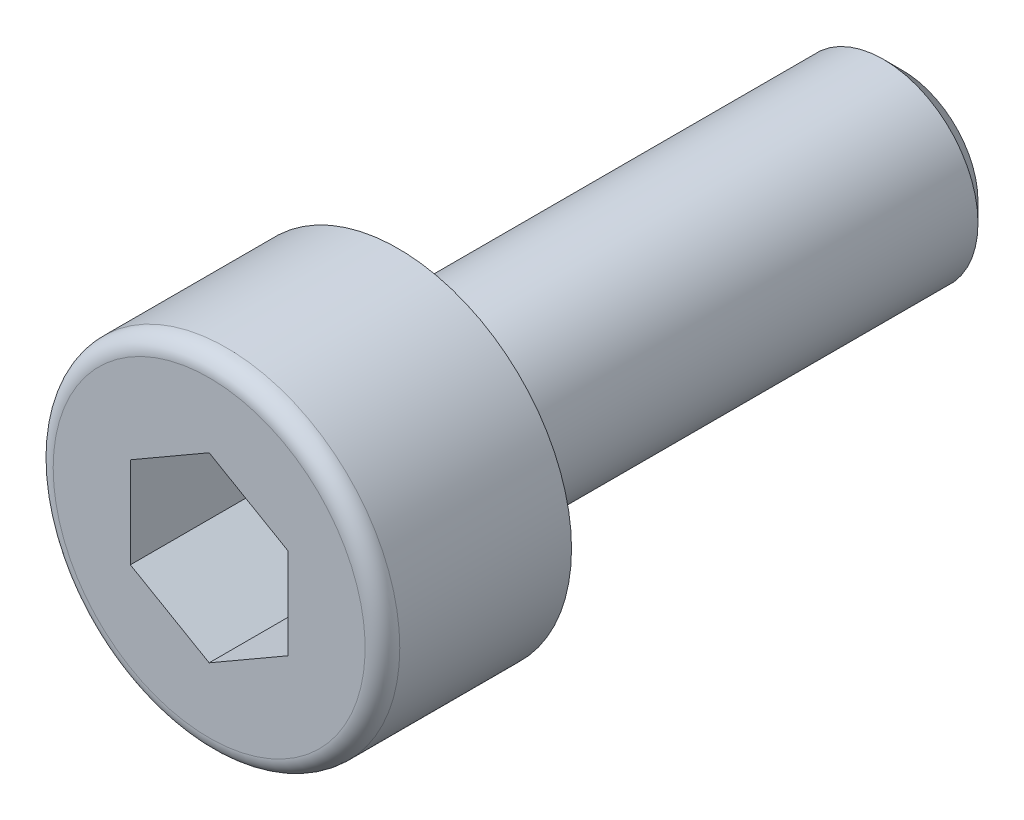
ISO-10303-21;
HEADER;
FILE_DESCRIPTION(('STEP AP214'),'2;1');
FILE_NAME('part.step','',(''),(''),'','','');
FILE_SCHEMA(('AUTOMOTIVE_DESIGN { 1 0 10303 214 1 1 1 1 }'));
ENDSEC;
DATA;
#1=APPLICATION_CONTEXT('core data for automotive mechanical design processes');
#2=APPLICATION_PROTOCOL_DEFINITION('international standard','automotive_design',2000,#1);
#3=PRODUCT_CONTEXT('',#1,'mechanical');
#4=PRODUCT('Part','Part','',(#3));
#5=PRODUCT_RELATED_PRODUCT_CATEGORY('part','',(#4));
#6=PRODUCT_DEFINITION_FORMATION('','',#4);
#7=PRODUCT_DEFINITION_CONTEXT('part definition',#1,'design');
#8=PRODUCT_DEFINITION('design','',#6,#7);
#9=PRODUCT_DEFINITION_SHAPE('','',#8);
#10=(LENGTH_UNIT() NAMED_UNIT(*) SI_UNIT(.MILLI.,.METRE.));
#11=(NAMED_UNIT(*) PLANE_ANGLE_UNIT() SI_UNIT($,.RADIAN.));
#12=(NAMED_UNIT(*) SI_UNIT($,.STERADIAN.) SOLID_ANGLE_UNIT());
#13=UNCERTAINTY_MEASURE_WITH_UNIT(LENGTH_MEASURE(1.E-05),#10,'distance_accuracy_value','');
#14=(GEOMETRIC_REPRESENTATION_CONTEXT(3) GLOBAL_UNCERTAINTY_ASSIGNED_CONTEXT((#13)) GLOBAL_UNIT_ASSIGNED_CONTEXT((#10,
#11,#12)) REPRESENTATION_CONTEXT('',''));
#15=CARTESIAN_POINT('',(0.,0.,0.));
#16=DIRECTION('',(0.,0.,1.));
#17=DIRECTION('',(1.,0.,0.));
#18=AXIS2_PLACEMENT_3D('',#15,#16,#17);
#19=CARTESIAN_POINT('',(0.,0.,3.));
#20=DIRECTION('',(0.,0.,-1.));
#21=DIRECTION('',(-1.,0.,0.));
#22=AXIS2_PLACEMENT_3D('',#19,#20,#21);
#23=PLANE('',#22);
#24=CARTESIAN_POINT('',(0.,0.,3.));
#25=DIRECTION('',(0.,0.,-1.));
#26=DIRECTION('',(-1.,0.,0.));
#27=AXIS2_PLACEMENT_3D('',#24,#25,#26);
#28=CIRCLE('',#27,2.475);
#29=CARTESIAN_POINT('',(-2.475,0.,3.));
#30=VERTEX_POINT('',#29);
#31=EDGE_CURVE('E177',#30,#30,#28,.F.);
#32=ORIENTED_EDGE('',*,*,#31,.T.);
#33=EDGE_LOOP('',(#32));
#34=FACE_BOUND('',#33,.T.);
#35=DIRECTION('',(-0.866025403784439,-0.5,0.));
#36=VECTOR('',#35,1.);
#37=CARTESIAN_POINT('',(0.,1.44337567297406,3.));
#38=LINE('',#37,#36);
#39=CARTESIAN_POINT('',(0.,1.44337567297406,3.));
#40=VERTEX_POINT('',#39);
#41=CARTESIAN_POINT('',(-1.25,0.721687836487032,3.));
#42=VERTEX_POINT('',#41);
#43=EDGE_CURVE('E141',#40,#42,#38,.T.);
#44=ORIENTED_EDGE('',*,*,#43,.F.);
#45=DIRECTION('',(-0.866025403784439,0.5,0.));
#46=VECTOR('',#45,1.);
#47=CARTESIAN_POINT('',(1.25,0.721687836487032,3.));
#48=LINE('',#47,#46);
#49=CARTESIAN_POINT('',(1.25,0.721687836487032,3.));
#50=VERTEX_POINT('',#49);
#51=EDGE_CURVE('E61',#50,#40,#48,.T.);
#52=ORIENTED_EDGE('',*,*,#51,.F.);
#53=DIRECTION('',(0.,1.,0.));
#54=VECTOR('',#53,1.);
#55=CARTESIAN_POINT('',(1.25,-0.721687836487032,3.));
#56=LINE('',#55,#54);
#57=CARTESIAN_POINT('',(1.25,-0.721687836487032,3.));
#58=VERTEX_POINT('',#57);
#59=EDGE_CURVE('E154',#58,#50,#56,.T.);
#60=ORIENTED_EDGE('',*,*,#59,.F.);
#61=DIRECTION('',(0.866025403784439,0.5,0.));
#62=VECTOR('',#61,1.);
#63=CARTESIAN_POINT('',(0.,-1.44337567297406,3.));
#64=LINE('',#63,#62);
#65=CARTESIAN_POINT('',(0.,-1.44337567297406,3.));
#66=VERTEX_POINT('',#65);
#67=EDGE_CURVE('E151',#66,#58,#64,.T.);
#68=ORIENTED_EDGE('',*,*,#67,.F.);
#69=DIRECTION('',(0.866025403784439,-0.5,0.));
#70=VECTOR('',#69,1.);
#71=CARTESIAN_POINT('',(-1.25,-0.721687836487033,3.));
#72=LINE('',#71,#70);
#73=CARTESIAN_POINT('',(-1.25,-0.721687836487033,3.));
#74=VERTEX_POINT('',#73);
#75=EDGE_CURVE('E109',#74,#66,#72,.T.);
#76=ORIENTED_EDGE('',*,*,#75,.F.);
#77=DIRECTION('',(0.,-1.,0.));
#78=VECTOR('',#77,1.);
#79=CARTESIAN_POINT('',(-1.25,0.721687836487032,3.));
#80=LINE('',#79,#78);
#81=EDGE_CURVE('E145',#42,#74,#80,.T.);
#82=ORIENTED_EDGE('',*,*,#81,.F.);
#83=EDGE_LOOP('',(#44,#52,#60,#68,#76,#82));
#84=FACE_BOUND('',#83,.T.);
#85=ADVANCED_FACE('F45',(#34,#84),#23,.F.);
#86=CARTESIAN_POINT('',(0.,0.,3.));
#87=DIRECTION('',(0.,0.,1.));
#88=DIRECTION('',(1.,0.,0.));
#89=AXIS2_PLACEMENT_3D('',#86,#87,#88);
#90=CYLINDRICAL_SURFACE('',#89,2.75);
#91=CARTESIAN_POINT('',(0.,0.,2.725));
#92=DIRECTION('',(0.,0.,-1.));
#93=DIRECTION('',(-1.,0.,0.));
#94=AXIS2_PLACEMENT_3D('',#91,#92,#93);
#95=CIRCLE('',#94,2.75);
#96=CARTESIAN_POINT('',(-2.75,0.,2.725));
#97=VERTEX_POINT('',#96);
#98=EDGE_CURVE('E181',#97,#97,#95,.T.);
#99=ORIENTED_EDGE('',*,*,#98,.T.);
#100=EDGE_LOOP('',(#99));
#101=FACE_BOUND('',#100,.T.);
#102=CARTESIAN_POINT('',(0.,0.,0.));
#103=DIRECTION('',(0.,0.,1.));
#104=DIRECTION('',(1.,0.,0.));
#105=AXIS2_PLACEMENT_3D('',#102,#103,#104);
#106=CIRCLE('',#105,2.75);
#107=CARTESIAN_POINT('',(2.75,0.,0.));
#108=VERTEX_POINT('',#107);
#109=EDGE_CURVE('E173',#108,#108,#106,.T.);
#110=ORIENTED_EDGE('',*,*,#109,.T.);
#111=EDGE_LOOP('',(#110));
#112=FACE_BOUND('',#111,.T.);
#113=ADVANCED_FACE('F201',(#101,#112),#90,.T.);
#114=CARTESIAN_POINT('',(0.,2.75,0.));
#115=DIRECTION('',(0.,0.,1.));
#116=DIRECTION('',(1.,0.,0.));
#117=AXIS2_PLACEMENT_3D('',#114,#115,#116);
#118=PLANE('',#117);
#119=ORIENTED_EDGE('',*,*,#109,.F.);
#120=EDGE_LOOP('',(#119));
#121=FACE_BOUND('',#120,.T.);
#122=CARTESIAN_POINT('',(0.,0.,0.));
#123=DIRECTION('',(0.,0.,1.));
#124=DIRECTION('',(1.,0.,0.));
#125=AXIS2_PLACEMENT_3D('',#122,#123,#124);
#126=CIRCLE('',#125,1.5);
#127=CARTESIAN_POINT('',(1.5,0.,0.));
#128=VERTEX_POINT('',#127);
#129=EDGE_CURVE('E160',#128,#128,#126,.T.);
#130=ORIENTED_EDGE('',*,*,#129,.T.);
#131=EDGE_LOOP('',(#130));
#132=FACE_BOUND('',#131,.T.);
#133=ADVANCED_FACE('F208',(#121,#132),#118,.F.);
#134=CARTESIAN_POINT('',(0.,0.,3.));
#135=DIRECTION('',(0.,0.,1.));
#136=DIRECTION('',(1.,0.,0.));
#137=AXIS2_PLACEMENT_3D('',#134,#135,#136);
#138=CYLINDRICAL_SURFACE('',#137,1.5);
#139=CARTESIAN_POINT('',(0.,0.,-7.7));
#140=DIRECTION('',(0.,0.,1.));
#141=DIRECTION('',(1.,0.,0.));
#142=AXIS2_PLACEMENT_3D('',#139,#140,#141);
#143=CIRCLE('',#142,1.5);
#144=CARTESIAN_POINT('',(1.5,0.,-7.7));
#145=VERTEX_POINT('',#144);
#146=EDGE_CURVE('E54',#145,#145,#143,.T.);
#147=ORIENTED_EDGE('',*,*,#146,.T.);
#148=EDGE_LOOP('',(#147));
#149=FACE_BOUND('',#148,.T.);
#150=ORIENTED_EDGE('',*,*,#129,.F.);
#151=EDGE_LOOP('',(#150));
#152=FACE_BOUND('',#151,.T.);
#153=ADVANCED_FACE('F188',(#149,#152),#138,.T.);
#154=CARTESIAN_POINT('',(0.,1.5,-8.));
#155=DIRECTION('',(0.,0.,1.));
#156=DIRECTION('',(1.,0.,0.));
#157=AXIS2_PLACEMENT_3D('',#154,#155,#156);
#158=PLANE('',#157);
#159=CARTESIAN_POINT('',(0.,0.,-8.));
#160=DIRECTION('',(0.,0.,1.));
#161=DIRECTION('',(1.,0.,0.));
#162=AXIS2_PLACEMENT_3D('',#159,#160,#161);
#163=CIRCLE('',#162,1.2);
#164=CARTESIAN_POINT('',(1.2,0.,-8.));
#165=VERTEX_POINT('',#164);
#166=EDGE_CURVE('E11',#165,#165,#163,.F.);
#167=ORIENTED_EDGE('',*,*,#166,.T.);
#168=EDGE_LOOP('',(#167));
#169=FACE_BOUND('',#168,.T.);
#170=ADVANCED_FACE('F218',(#169),#158,.F.);
#171=CARTESIAN_POINT('',(1.25,0.721687836487032,1.075));
#172=DIRECTION('',(0.5,0.866025403784439,0.));
#173=DIRECTION('',(-0.866025403784439,0.5,0.));
#174=AXIS2_PLACEMENT_3D('',#171,#172,#173);
#175=PLANE('',#174);
#176=ORIENTED_EDGE('',*,*,#51,.T.);
#177=DIRECTION('',(0.,0.,1.));
#178=VECTOR('',#177,1.);
#179=CARTESIAN_POINT('',(0.,1.44337567297406,1.075));
#180=LINE('',#179,#178);
#181=CARTESIAN_POINT('',(0.,1.44337567297406,1.075));
#182=VERTEX_POINT('',#181);
#183=EDGE_CURVE('E91',#182,#40,#180,.T.);
#184=ORIENTED_EDGE('',*,*,#183,.F.);
#185=DIRECTION('',(-0.866025403784439,0.5,0.));
#186=VECTOR('',#185,1.);
#187=CARTESIAN_POINT('',(1.25,0.721687836487032,1.075));
#188=LINE('',#187,#186);
#189=CARTESIAN_POINT('',(1.25,0.721687836487032,1.075));
#190=VERTEX_POINT('',#189);
#191=EDGE_CURVE('E157',#190,#182,#188,.T.);
#192=ORIENTED_EDGE('',*,*,#191,.F.);
#193=DIRECTION('',(0.,0.,1.));
#194=VECTOR('',#193,1.);
#195=CARTESIAN_POINT('',(1.25,0.721687836487032,1.075));
#196=LINE('',#195,#194);
#197=EDGE_CURVE('E69',#190,#50,#196,.T.);
#198=ORIENTED_EDGE('',*,*,#197,.T.);
#199=EDGE_LOOP('',(#176,#184,#192,#198));
#200=FACE_BOUND('',#199,.T.);
#201=ADVANCED_FACE('F220',(#200),#175,.F.);
#202=CARTESIAN_POINT('',(1.25,-0.721687836487032,1.075));
#203=DIRECTION('',(1.,0.,0.));
#204=DIRECTION('',(0.,0.,-1.));
#205=AXIS2_PLACEMENT_3D('',#202,#203,#204);
#206=PLANE('',#205);
#207=ORIENTED_EDGE('',*,*,#59,.T.);
#208=ORIENTED_EDGE('',*,*,#197,.F.);
#209=DIRECTION('',(0.,1.,0.));
#210=VECTOR('',#209,1.);
#211=CARTESIAN_POINT('',(1.25,-0.721687836487032,1.075));
#212=LINE('',#211,#210);
#213=CARTESIAN_POINT('',(1.25,-0.721687836487032,1.075));
#214=VERTEX_POINT('',#213);
#215=EDGE_CURVE('E123',#214,#190,#212,.T.);
#216=ORIENTED_EDGE('',*,*,#215,.F.);
#217=DIRECTION('',(0.,0.,1.));
#218=VECTOR('',#217,1.);
#219=CARTESIAN_POINT('',(1.25,-0.721687836487032,1.075));
#220=LINE('',#219,#218);
#221=EDGE_CURVE('E114',#214,#58,#220,.T.);
#222=ORIENTED_EDGE('',*,*,#221,.T.);
#223=EDGE_LOOP('',(#207,#208,#216,#222));
#224=FACE_BOUND('',#223,.T.);
#225=ADVANCED_FACE('F224',(#224),#206,.F.);
#226=CARTESIAN_POINT('',(0.,-1.44337567297406,1.075));
#227=DIRECTION('',(0.5,-0.866025403784439,0.));
#228=DIRECTION('',(0.866025403784439,0.5,0.));
#229=AXIS2_PLACEMENT_3D('',#226,#227,#228);
#230=PLANE('',#229);
#231=ORIENTED_EDGE('',*,*,#67,.T.);
#232=ORIENTED_EDGE('',*,*,#221,.F.);
#233=DIRECTION('',(0.866025403784439,0.5,0.));
#234=VECTOR('',#233,1.);
#235=CARTESIAN_POINT('',(0.,-1.44337567297406,1.075));
#236=LINE('',#235,#234);
#237=CARTESIAN_POINT('',(0.,-1.44337567297406,1.075));
#238=VERTEX_POINT('',#237);
#239=EDGE_CURVE('E118',#238,#214,#236,.T.);
#240=ORIENTED_EDGE('',*,*,#239,.F.);
#241=DIRECTION('',(0.,0.,1.));
#242=VECTOR('',#241,1.);
#243=CARTESIAN_POINT('',(0.,-1.44337567297406,1.075));
#244=LINE('',#243,#242);
#245=EDGE_CURVE('E102',#238,#66,#244,.T.);
#246=ORIENTED_EDGE('',*,*,#245,.T.);
#247=EDGE_LOOP('',(#231,#232,#240,#246));
#248=FACE_BOUND('',#247,.T.);
#249=ADVANCED_FACE('F119',(#248),#230,.F.);
#250=CARTESIAN_POINT('',(-1.25,-0.721687836487033,1.075));
#251=DIRECTION('',(-0.5,-0.866025403784439,0.));
#252=DIRECTION('',(0.866025403784439,-0.5,0.));
#253=AXIS2_PLACEMENT_3D('',#250,#251,#252);
#254=PLANE('',#253);
#255=ORIENTED_EDGE('',*,*,#75,.T.);
#256=ORIENTED_EDGE('',*,*,#245,.F.);
#257=DIRECTION('',(0.866025403784439,-0.5,0.));
#258=VECTOR('',#257,1.);
#259=CARTESIAN_POINT('',(-1.25,-0.721687836487033,1.075));
#260=LINE('',#259,#258);
#261=CARTESIAN_POINT('',(-1.25,-0.721687836487033,1.075));
#262=VERTEX_POINT('',#261);
#263=EDGE_CURVE('E106',#262,#238,#260,.T.);
#264=ORIENTED_EDGE('',*,*,#263,.F.);
#265=DIRECTION('',(0.,0.,1.));
#266=VECTOR('',#265,1.);
#267=CARTESIAN_POINT('',(-1.25,-0.721687836487033,1.075));
#268=LINE('',#267,#266);
#269=EDGE_CURVE('E115',#262,#74,#268,.T.);
#270=ORIENTED_EDGE('',*,*,#269,.T.);
#271=EDGE_LOOP('',(#255,#256,#264,#270));
#272=FACE_BOUND('',#271,.T.);
#273=ADVANCED_FACE('F104',(#272),#254,.F.);
#274=CARTESIAN_POINT('',(-1.25,0.721687836487032,1.075));
#275=DIRECTION('',(-1.,0.,0.));
#276=DIRECTION('',(0.,-1.,0.));
#277=AXIS2_PLACEMENT_3D('',#274,#275,#276);
#278=PLANE('',#277);
#279=ORIENTED_EDGE('',*,*,#81,.T.);
#280=ORIENTED_EDGE('',*,*,#269,.F.);
#281=DIRECTION('',(0.,-1.,0.));
#282=VECTOR('',#281,1.);
#283=CARTESIAN_POINT('',(-1.25,0.721687836487032,1.075));
#284=LINE('',#283,#282);
#285=CARTESIAN_POINT('',(-1.25,0.721687836487032,1.075));
#286=VERTEX_POINT('',#285);
#287=EDGE_CURVE('E129',#286,#262,#284,.T.);
#288=ORIENTED_EDGE('',*,*,#287,.F.);
#289=DIRECTION('',(0.,0.,1.));
#290=VECTOR('',#289,1.);
#291=CARTESIAN_POINT('',(-1.25,0.721687836487032,1.075));
#292=LINE('',#291,#290);
#293=EDGE_CURVE('E165',#286,#42,#292,.T.);
#294=ORIENTED_EDGE('',*,*,#293,.T.);
#295=EDGE_LOOP('',(#279,#280,#288,#294));
#296=FACE_BOUND('',#295,.T.);
#297=ADVANCED_FACE('F228',(#296),#278,.F.);
#298=CARTESIAN_POINT('',(0.,1.44337567297406,1.075));
#299=DIRECTION('',(-0.5,0.866025403784439,0.));
#300=DIRECTION('',(-0.866025403784439,-0.5,0.));
#301=AXIS2_PLACEMENT_3D('',#298,#299,#300);
#302=PLANE('',#301);
#303=ORIENTED_EDGE('',*,*,#43,.T.);
#304=ORIENTED_EDGE('',*,*,#293,.F.);
#305=DIRECTION('',(-0.866025403784439,-0.5,0.));
#306=VECTOR('',#305,1.);
#307=CARTESIAN_POINT('',(0.,1.44337567297406,1.075));
#308=LINE('',#307,#306);
#309=EDGE_CURVE('E133',#182,#286,#308,.T.);
#310=ORIENTED_EDGE('',*,*,#309,.F.);
#311=ORIENTED_EDGE('',*,*,#183,.T.);
#312=EDGE_LOOP('',(#303,#304,#310,#311));
#313=FACE_BOUND('',#312,.T.);
#314=ADVANCED_FACE('F225',(#313),#302,.F.);
#315=CARTESIAN_POINT('',(0.,1.44337567297406,1.075));
#316=DIRECTION('',(0.,0.,1.));
#317=DIRECTION('',(1.,0.,0.));
#318=AXIS2_PLACEMENT_3D('',#315,#316,#317);
#319=PLANE('',#318);
#320=ORIENTED_EDGE('',*,*,#191,.T.);
#321=ORIENTED_EDGE('',*,*,#309,.T.);
#322=ORIENTED_EDGE('',*,*,#287,.T.);
#323=ORIENTED_EDGE('',*,*,#263,.T.);
#324=ORIENTED_EDGE('',*,*,#239,.T.);
#325=ORIENTED_EDGE('',*,*,#215,.T.);
#326=EDGE_LOOP('',(#320,#321,#322,#323,#324,#325));
#327=FACE_BOUND('',#326,.T.);
#328=ADVANCED_FACE('F126',(#327),#319,.T.);
#329=CARTESIAN_POINT('',(0.,0.,2.725));
#330=DIRECTION('',(0.,0.,-1.));
#331=DIRECTION('',(-1.,0.,0.));
#332=AXIS2_PLACEMENT_3D('',#329,#330,#331);
#333=TOROIDAL_SURFACE('',#332,2.475,0.275);
#334=ORIENTED_EDGE('',*,*,#98,.F.);
#335=EDGE_LOOP('',(#334));
#336=FACE_BOUND('',#335,.T.);
#337=ORIENTED_EDGE('',*,*,#31,.F.);
#338=EDGE_LOOP('',(#337));
#339=FACE_BOUND('',#338,.T.);
#340=ADVANCED_FACE('F192',(#336,#339),#333,.T.);
#341=CARTESIAN_POINT('',(0.,0.,-7.7));
#342=DIRECTION('',(0.,0.,1.));
#343=DIRECTION('',(1.,0.,0.));
#344=AXIS2_PLACEMENT_3D('',#341,#342,#343);
#345=CONICAL_SURFACE('',#344,1.5,0.785398163397449);
#346=ORIENTED_EDGE('',*,*,#166,.F.);
#347=EDGE_LOOP('',(#346));
#348=FACE_BOUND('',#347,.T.);
#349=ORIENTED_EDGE('',*,*,#146,.F.);
#350=EDGE_LOOP('',(#349));
#351=FACE_BOUND('',#350,.T.);
#352=ADVANCED_FACE('F47',(#348,#351),#345,.T.);
#353=CLOSED_SHELL('',(#85,#113,#133,#153,#170,#201,#225,#249,#273,#297,#314,#328,#340,#352));
#354=MANIFOLD_SOLID_BREP('B2',#353);
#355=ADVANCED_BREP_SHAPE_REPRESENTATION('',(#18,#354),#14);
#356=SHAPE_DEFINITION_REPRESENTATION(#9,#355);
ENDSEC;
END-ISO-10303-21;
